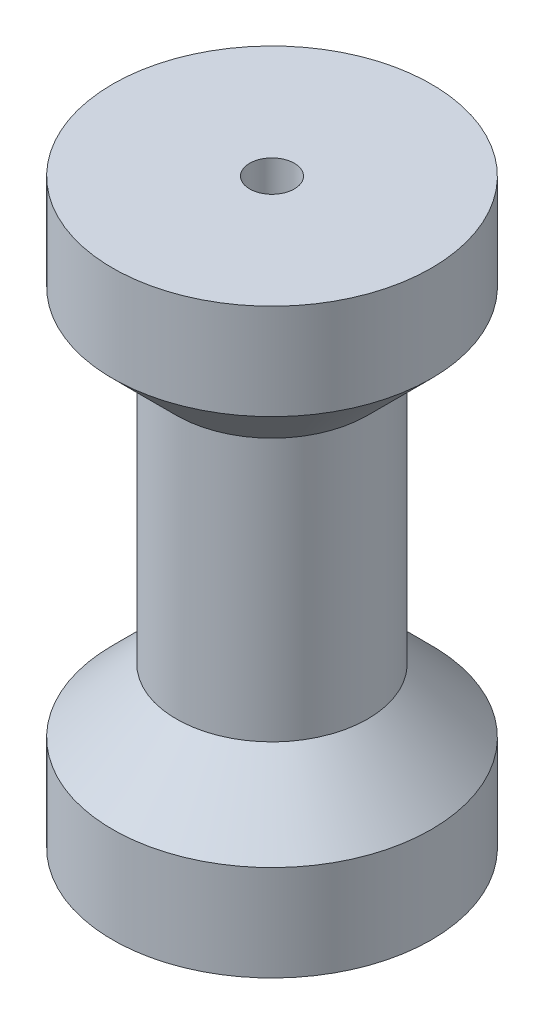
ISO-10303-21;
HEADER;
FILE_DESCRIPTION(('STEP AP214'),'2;1');
FILE_NAME('part.step','',(''),(''),'','','');
FILE_SCHEMA(('AUTOMOTIVE_DESIGN { 1 0 10303 214 1 1 1 1 }'));
ENDSEC;
DATA;
#1=APPLICATION_CONTEXT('core data for automotive mechanical design processes');
#2=APPLICATION_PROTOCOL_DEFINITION('international standard','automotive_design',2000,#1);
#3=PRODUCT_CONTEXT('',#1,'mechanical');
#4=PRODUCT('Part','Part','',(#3));
#5=PRODUCT_RELATED_PRODUCT_CATEGORY('part','',(#4));
#6=PRODUCT_DEFINITION_FORMATION('','',#4);
#7=PRODUCT_DEFINITION_CONTEXT('part definition',#1,'design');
#8=PRODUCT_DEFINITION('design','',#6,#7);
#9=PRODUCT_DEFINITION_SHAPE('','',#8);
#10=(LENGTH_UNIT() NAMED_UNIT(*) SI_UNIT(.MILLI.,.METRE.));
#11=(NAMED_UNIT(*) PLANE_ANGLE_UNIT() SI_UNIT($,.RADIAN.));
#12=(NAMED_UNIT(*) SI_UNIT($,.STERADIAN.) SOLID_ANGLE_UNIT());
#13=UNCERTAINTY_MEASURE_WITH_UNIT(LENGTH_MEASURE(1.E-05),#10,'distance_accuracy_value','');
#14=(GEOMETRIC_REPRESENTATION_CONTEXT(3) GLOBAL_UNCERTAINTY_ASSIGNED_CONTEXT((#13)) GLOBAL_UNIT_ASSIGNED_CONTEXT((#10,
#11,#12)) REPRESENTATION_CONTEXT('',''));
#15=CARTESIAN_POINT('',(0.,0.,0.));
#16=DIRECTION('',(0.,0.,1.));
#17=DIRECTION('',(1.,0.,0.));
#18=AXIS2_PLACEMENT_3D('',#15,#16,#17);
#19=CARTESIAN_POINT('',(10.,0.,0.));
#20=DIRECTION('',(0.,-1.,0.));
#21=DIRECTION('',(1.,0.,0.));
#22=AXIS2_PLACEMENT_3D('',#19,#20,#21);
#23=PLANE('',#22);
#24=CARTESIAN_POINT('',(0.,0.,0.));
#25=DIRECTION('',(0.,-1.,0.));
#26=DIRECTION('',(1.,0.,0.));
#27=AXIS2_PLACEMENT_3D('',#24,#25,#26);
#28=CIRCLE('',#27,10.);
#29=CARTESIAN_POINT('',(10.,0.,0.));
#30=VERTEX_POINT('',#29);
#31=EDGE_CURVE('E82',#30,#30,#28,.T.);
#32=ORIENTED_EDGE('',*,*,#31,.T.);
#33=EDGE_LOOP('',(#32));
#34=FACE_BOUND('',#33,.T.);
#35=CARTESIAN_POINT('',(0.,0.,0.));
#36=DIRECTION('',(0.,-1.,0.));
#37=DIRECTION('',(1.,0.,0.));
#38=AXIS2_PLACEMENT_3D('',#35,#36,#37);
#39=CIRCLE('',#38,1.39999999999999);
#40=CARTESIAN_POINT('',(1.4,0.,0.));
#41=VERTEX_POINT('',#40);
#42=EDGE_CURVE('E59',#41,#41,#39,.T.);
#43=ORIENTED_EDGE('',*,*,#42,.F.);
#44=EDGE_LOOP('',(#43));
#45=FACE_BOUND('',#44,.T.);
#46=ADVANCED_FACE('F45',(#34,#45),#23,.T.);
#47=CARTESIAN_POINT('',(0.,-42.8218905183214,0.));
#48=DIRECTION('',(0.,-1.,0.));
#49=DIRECTION('',(1.,0.,0.));
#50=AXIS2_PLACEMENT_3D('',#47,#48,#49);
#51=CYLINDRICAL_SURFACE('',#50,1.4);
#52=ORIENTED_EDGE('',*,*,#42,.T.);
#53=EDGE_LOOP('',(#52));
#54=FACE_BOUND('',#53,.T.);
#55=CARTESIAN_POINT('',(0.,36.5,0.));
#56=DIRECTION('',(0.,-1.,0.));
#57=DIRECTION('',(1.,0.,0.));
#58=AXIS2_PLACEMENT_3D('',#55,#56,#57);
#59=CIRCLE('',#58,1.4);
#60=CARTESIAN_POINT('',(1.4,36.5,0.));
#61=VERTEX_POINT('',#60);
#62=EDGE_CURVE('E64',#61,#61,#59,.T.);
#63=ORIENTED_EDGE('',*,*,#62,.F.);
#64=EDGE_LOOP('',(#63));
#65=FACE_BOUND('',#64,.T.);
#66=ADVANCED_FACE('F104',(#54,#65),#51,.F.);
#67=CARTESIAN_POINT('',(1.4,36.5,0.));
#68=DIRECTION('',(0.,1.,0.));
#69=DIRECTION('',(-1.,0.,0.));
#70=AXIS2_PLACEMENT_3D('',#67,#68,#69);
#71=PLANE('',#70);
#72=ORIENTED_EDGE('',*,*,#62,.T.);
#73=EDGE_LOOP('',(#72));
#74=FACE_BOUND('',#73,.T.);
#75=CARTESIAN_POINT('',(0.,36.5,0.));
#76=DIRECTION('',(0.,-1.,0.));
#77=DIRECTION('',(1.,0.,0.));
#78=AXIS2_PLACEMENT_3D('',#75,#76,#77);
#79=CIRCLE('',#78,10.);
#80=CARTESIAN_POINT('',(10.,36.5,0.));
#81=VERTEX_POINT('',#80);
#82=EDGE_CURVE('E70',#81,#81,#79,.T.);
#83=ORIENTED_EDGE('',*,*,#82,.F.);
#84=EDGE_LOOP('',(#83));
#85=FACE_BOUND('',#84,.T.);
#86=ADVANCED_FACE('F109',(#74,#85),#71,.T.);
#87=CARTESIAN_POINT('',(0.,-42.8218905183214,0.));
#88=DIRECTION('',(0.,-1.,0.));
#89=DIRECTION('',(1.,0.,0.));
#90=AXIS2_PLACEMENT_3D('',#87,#88,#89);
#91=CYLINDRICAL_SURFACE('',#90,10.);
#92=ORIENTED_EDGE('',*,*,#82,.T.);
#93=EDGE_LOOP('',(#92));
#94=FACE_BOUND('',#93,.T.);
#95=CARTESIAN_POINT('',(0.,30.5,0.));
#96=DIRECTION('',(0.,-1.,0.));
#97=DIRECTION('',(1.,0.,0.));
#98=AXIS2_PLACEMENT_3D('',#95,#96,#97);
#99=CIRCLE('',#98,10.);
#100=CARTESIAN_POINT('',(10.,30.5,0.));
#101=VERTEX_POINT('',#100);
#102=EDGE_CURVE('E74',#101,#101,#99,.T.);
#103=ORIENTED_EDGE('',*,*,#102,.F.);
#104=EDGE_LOOP('',(#103));
#105=FACE_BOUND('',#104,.T.);
#106=ADVANCED_FACE('F101',(#94,#105),#91,.T.);
#107=CARTESIAN_POINT('',(0.,-42.8218905183214,0.));
#108=DIRECTION('',(0.,-1.,0.));
#109=DIRECTION('',(1.,0.,0.));
#110=AXIS2_PLACEMENT_3D('',#107,#108,#109);
#111=CYLINDRICAL_SURFACE('',#110,6.);
#112=CARTESIAN_POINT('',(0.,9.99999999999997,0.));
#113=DIRECTION('',(0.,1.,0.));
#114=DIRECTION('',(-1.,0.,0.));
#115=AXIS2_PLACEMENT_3D('',#112,#113,#114);
#116=CIRCLE('',#115,6.);
#117=CARTESIAN_POINT('',(-5.99999999999999,9.99999999999997,0.));
#118=VERTEX_POINT('',#117);
#119=EDGE_CURVE('E10',#118,#118,#116,.T.);
#120=ORIENTED_EDGE('',*,*,#119,.T.);
#121=EDGE_LOOP('',(#120));
#122=FACE_BOUND('',#121,.T.);
#123=CARTESIAN_POINT('',(0.,26.5,0.));
#124=DIRECTION('',(0.,-1.,0.));
#125=DIRECTION('',(1.,0.,0.));
#126=AXIS2_PLACEMENT_3D('',#123,#124,#125);
#127=CIRCLE('',#126,6.);
#128=CARTESIAN_POINT('',(6.,26.5,0.));
#129=VERTEX_POINT('',#128);
#130=EDGE_CURVE('E54',#129,#129,#127,.T.);
#131=ORIENTED_EDGE('',*,*,#130,.T.);
#132=EDGE_LOOP('',(#131));
#133=FACE_BOUND('',#132,.T.);
#134=ADVANCED_FACE('F92',(#122,#133),#111,.T.);
#135=CARTESIAN_POINT('',(0.,-42.8218905183214,0.));
#136=DIRECTION('',(0.,-1.,0.));
#137=DIRECTION('',(1.,0.,0.));
#138=AXIS2_PLACEMENT_3D('',#135,#136,#137);
#139=CYLINDRICAL_SURFACE('',#138,10.);
#140=CARTESIAN_POINT('',(0.,6.,0.));
#141=DIRECTION('',(0.,-1.,0.));
#142=DIRECTION('',(1.,0.,0.));
#143=AXIS2_PLACEMENT_3D('',#140,#141,#142);
#144=CIRCLE('',#143,10.);
#145=CARTESIAN_POINT('',(10.,6.,0.));
#146=VERTEX_POINT('',#145);
#147=EDGE_CURVE('E78',#146,#146,#144,.T.);
#148=ORIENTED_EDGE('',*,*,#147,.T.);
#149=EDGE_LOOP('',(#148));
#150=FACE_BOUND('',#149,.T.);
#151=ORIENTED_EDGE('',*,*,#31,.F.);
#152=EDGE_LOOP('',(#151));
#153=FACE_BOUND('',#152,.T.);
#154=ADVANCED_FACE('F89',(#150,#153),#139,.T.);
#155=CARTESIAN_POINT('',(0.,6.,0.));
#156=DIRECTION('',(0.,-1.,0.));
#157=DIRECTION('',(1.,0.,0.));
#158=AXIS2_PLACEMENT_3D('',#155,#156,#157);
#159=CONICAL_SURFACE('',#158,10.,0.785398163397454);
#160=ORIENTED_EDGE('',*,*,#119,.F.);
#161=EDGE_LOOP('',(#160));
#162=FACE_BOUND('',#161,.T.);
#163=ORIENTED_EDGE('',*,*,#147,.F.);
#164=EDGE_LOOP('',(#163));
#165=FACE_BOUND('',#164,.T.);
#166=ADVANCED_FACE('F91',(#162,#165),#159,.T.);
#167=CARTESIAN_POINT('',(0.,26.5,0.));
#168=DIRECTION('',(0.,1.,0.));
#169=DIRECTION('',(-1.,0.,0.));
#170=AXIS2_PLACEMENT_3D('',#167,#168,#169);
#171=CONICAL_SURFACE('',#170,6.,0.785398163397443);
#172=ORIENTED_EDGE('',*,*,#102,.T.);
#173=EDGE_LOOP('',(#172));
#174=FACE_BOUND('',#173,.T.);
#175=ORIENTED_EDGE('',*,*,#130,.F.);
#176=EDGE_LOOP('',(#175));
#177=FACE_BOUND('',#176,.T.);
#178=ADVANCED_FACE('F48',(#174,#177),#171,.T.);
#179=CLOSED_SHELL('',(#46,#66,#86,#106,#134,#154,#166,#178));
#180=MANIFOLD_SOLID_BREP('B2',#179);
#181=ADVANCED_BREP_SHAPE_REPRESENTATION('',(#18,#180),#14);
#182=SHAPE_DEFINITION_REPRESENTATION(#9,#181);
ENDSEC;
END-ISO-10303-21;
